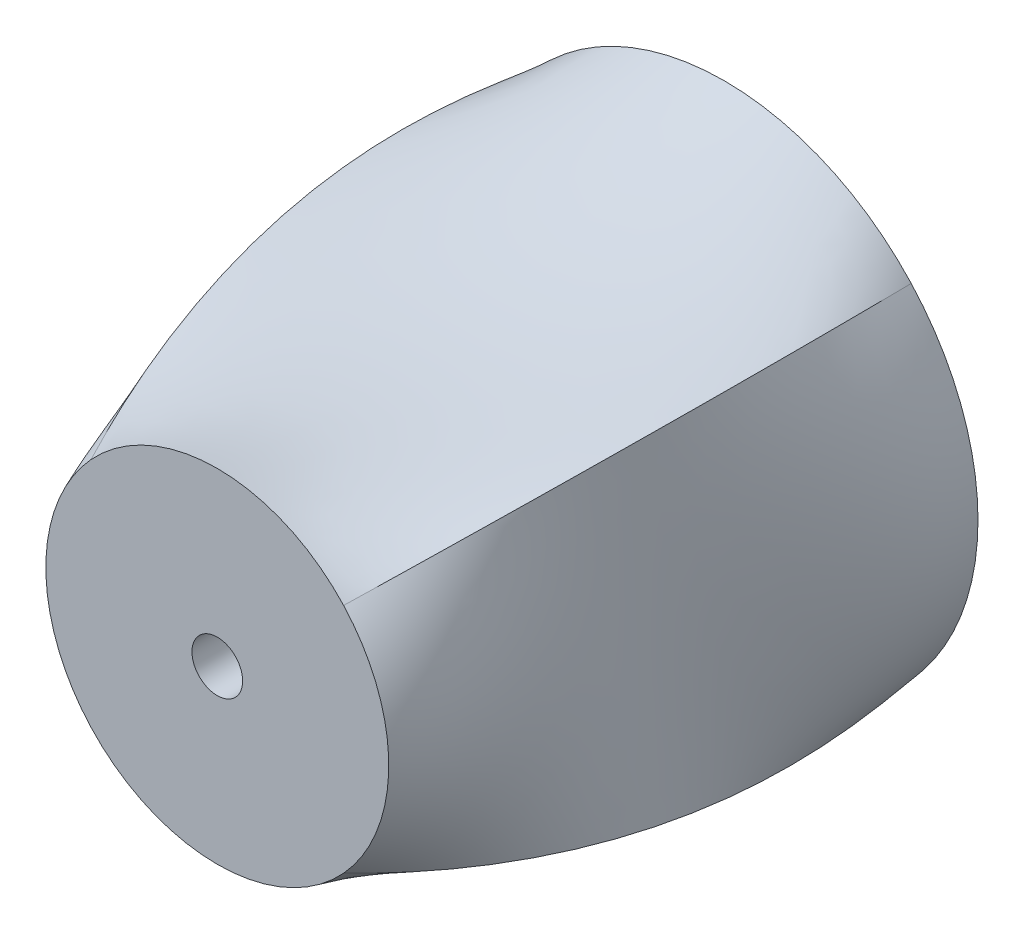
ISO-10303-21;
HEADER;
FILE_DESCRIPTION(('STEP AP214'),'2;1');
FILE_NAME('part.step','',(''),(''),'','','');
FILE_SCHEMA(('AUTOMOTIVE_DESIGN { 1 0 10303 214 1 1 1 1 }'));
ENDSEC;
DATA;
#1=APPLICATION_CONTEXT('core data for automotive mechanical design processes');
#2=APPLICATION_PROTOCOL_DEFINITION('international standard','automotive_design',2000,#1);
#3=PRODUCT_CONTEXT('',#1,'mechanical');
#4=PRODUCT('Part','Part','',(#3));
#5=PRODUCT_RELATED_PRODUCT_CATEGORY('part','',(#4));
#6=PRODUCT_DEFINITION_FORMATION('','',#4);
#7=PRODUCT_DEFINITION_CONTEXT('part definition',#1,'design');
#8=PRODUCT_DEFINITION('design','',#6,#7);
#9=PRODUCT_DEFINITION_SHAPE('','',#8);
#10=(LENGTH_UNIT() NAMED_UNIT(*) SI_UNIT(.MILLI.,.METRE.));
#11=(NAMED_UNIT(*) PLANE_ANGLE_UNIT() SI_UNIT($,.RADIAN.));
#12=(NAMED_UNIT(*) SI_UNIT($,.STERADIAN.) SOLID_ANGLE_UNIT());
#13=UNCERTAINTY_MEASURE_WITH_UNIT(LENGTH_MEASURE(1.E-05),#10,'distance_accuracy_value','');
#14=(GEOMETRIC_REPRESENTATION_CONTEXT(3) GLOBAL_UNCERTAINTY_ASSIGNED_CONTEXT((#13)) GLOBAL_UNIT_ASSIGNED_CONTEXT((#10,
#11,#12)) REPRESENTATION_CONTEXT('',''));
#15=CARTESIAN_POINT('',(0.,0.,0.));
#16=DIRECTION('',(0.,0.,1.));
#17=DIRECTION('',(1.,0.,0.));
#18=AXIS2_PLACEMENT_3D('',#15,#16,#17);
#19=CARTESIAN_POINT('',(0.,0.,100.));
#20=DIRECTION('',(0.,0.,1.));
#21=DIRECTION('',(1.,0.,0.));
#22=AXIS2_PLACEMENT_3D('',#19,#20,#21);
#23=PLANE('',#22);
#24=CARTESIAN_POINT('',(0.,0.,100.));
#25=DIRECTION('',(0.,0.,1.));
#26=DIRECTION('',(1.,0.,0.));
#27=AXIS2_PLACEMENT_3D('',#24,#25,#26);
#28=CIRCLE('',#27,5.);
#29=CARTESIAN_POINT('',(5.,0.,100.));
#30=VERTEX_POINT('',#29);
#31=EDGE_CURVE('E378',#30,#30,#28,.T.);
#32=ORIENTED_EDGE('',*,*,#31,.F.);
#33=EDGE_LOOP('',(#32));
#34=FACE_BOUND('',#33,.T.);
#35=CARTESIAN_POINT('',(0.,0.,100.));
#36=DIRECTION('',(0.,0.,1.));
#37=DIRECTION('',(1.,0.,0.));
#38=AXIS2_PLACEMENT_3D('',#35,#36,#37);
#39=CIRCLE('',#38,33.8111191585209);
#40=CARTESIAN_POINT('',(24.9085688378419,-22.863835575034,100.));
#41=VERTEX_POINT('',#40);
#42=CARTESIAN_POINT('',(24.9085688378419,22.863835575034,100.));
#43=VERTEX_POINT('',#42);
#44=EDGE_CURVE('E12',#41,#43,#39,.T.);
#45=ORIENTED_EDGE('',*,*,#44,.T.);
#46=CARTESIAN_POINT('',(-24.9085688378419,22.863835575034,100.));
#47=VERTEX_POINT('',#46);
#48=EDGE_CURVE('E159',#43,#47,#39,.T.);
#49=ORIENTED_EDGE('',*,*,#48,.T.);
#50=CARTESIAN_POINT('',(-24.9085688378419,-22.863835575034,100.));
#51=VERTEX_POINT('',#50);
#52=EDGE_CURVE('E304',#47,#51,#39,.T.);
#53=ORIENTED_EDGE('',*,*,#52,.T.);
#54=EDGE_CURVE('E224',#51,#41,#39,.T.);
#55=ORIENTED_EDGE('',*,*,#54,.T.);
#56=EDGE_LOOP('',(#45,#49,#53,#55));
#57=FACE_BOUND('',#56,.T.);
#58=ADVANCED_FACE('F149',(#34,#57),#23,.T.);
#59=CARTESIAN_POINT('',(0.,0.,0.));
#60=DIRECTION('',(0.,0.,1.));
#61=DIRECTION('',(1.,0.,0.));
#62=AXIS2_PLACEMENT_3D('',#59,#60,#61);
#63=PLANE('',#62);
#64=CARTESIAN_POINT('',(0.,0.,0.));
#65=DIRECTION('',(0.,0.,1.));
#66=DIRECTION('',(1.,0.,0.));
#67=AXIS2_PLACEMENT_3D('',#64,#65,#66);
#68=CIRCLE('',#67,5.);
#69=CARTESIAN_POINT('',(5.,0.,0.));
#70=VERTEX_POINT('',#69);
#71=EDGE_CURVE('E153',#70,#70,#68,.T.);
#72=ORIENTED_EDGE('',*,*,#71,.T.);
#73=EDGE_LOOP('',(#72));
#74=FACE_BOUND('',#73,.T.);
#75=CARTESIAN_POINT('',(0.,0.,0.));
#76=DIRECTION('',(0.,0.,1.));
#77=DIRECTION('',(1.,0.,0.));
#78=AXIS2_PLACEMENT_3D('',#75,#76,#77);
#79=CIRCLE('',#78,50.);
#80=CARTESIAN_POINT('',(-36.8348777824537,-33.8111191585209,0.));
#81=VERTEX_POINT('',#80);
#82=CARTESIAN_POINT('',(36.8348777824537,-33.8111191585209,0.));
#83=VERTEX_POINT('',#82);
#84=EDGE_CURVE('E192',#81,#83,#79,.T.);
#85=ORIENTED_EDGE('',*,*,#84,.F.);
#86=CARTESIAN_POINT('',(-36.8348777824537,33.8111191585209,0.));
#87=VERTEX_POINT('',#86);
#88=EDGE_CURVE('E197',#87,#81,#79,.T.);
#89=ORIENTED_EDGE('',*,*,#88,.F.);
#90=CARTESIAN_POINT('',(36.8348777824537,33.8111191585209,0.));
#91=VERTEX_POINT('',#90);
#92=EDGE_CURVE('E218',#91,#87,#79,.T.);
#93=ORIENTED_EDGE('',*,*,#92,.F.);
#94=EDGE_CURVE('E199',#83,#91,#79,.T.);
#95=ORIENTED_EDGE('',*,*,#94,.F.);
#96=EDGE_LOOP('',(#85,#89,#93,#95));
#97=FACE_BOUND('',#96,.T.);
#98=ADVANCED_FACE('F195',(#74,#97),#63,.F.);
#99=CARTESIAN_POINT('',(36.8348777824537,33.8111191585209,0.));
#100=CARTESIAN_POINT('',(38.7718322634079,35.5890699134266,17.092311153296));
#101=CARTESIAN_POINT('',(38.8550763426713,35.6654805234968,49.7278342205279));
#102=CARTESIAN_POINT('',(30.8209596336667,28.2908808577686,83.7589778199627));
#103=CARTESIAN_POINT('',(24.9085688378419,22.863835575034,100.));
#104=CARTESIAN_POINT('',(35.6512521446015,35.1005974956933,0.));
#105=CARTESIAN_POINT('',(37.3200602112271,36.1182014821361,17.0333694923934));
#106=CARTESIAN_POINT('',(37.1120592679594,35.2770256377292,49.7867765062497));
#107=CARTESIAN_POINT('',(29.6207735378854,28.5373493174208,83.7000361590601));
#108=CARTESIAN_POINT('',(24.1081746882319,23.7358096892433,100.));
#109=CARTESIAN_POINT('',(33.1620391276802,37.5407026365282,0.));
#110=CARTESIAN_POINT('',(34.2945543656487,37.0376130860452,16.9154861705881));
#111=CARTESIAN_POINT('',(33.7278074501986,34.6165886144866,49.9046610776935));
#112=CARTESIAN_POINT('',(27.1389872817655,28.9364017916043,83.5821528372548));
#113=CARTESIAN_POINT('',(22.4259723244545,25.3858734725413,100.));
#114=CARTESIAN_POINT('',(29.1024569762608,40.7676532680052,0.));
#115=CARTESIAN_POINT('',(29.6838530371143,38.321323826022,16.7514735213785));
#116=CARTESIAN_POINT('',(28.6947373206306,33.6808124087832,50.0686754655418));
#117=CARTESIAN_POINT('',(23.4024057279429,29.5210046177212,83.4181401880452));
#118=CARTESIAN_POINT('',(19.6810138029427,27.5679815727595,100.));
#119=CARTESIAN_POINT('',(24.7519278716949,43.5444546827326,0.));
#120=CARTESIAN_POINT('',(24.939349349651,39.4130258197402,16.6035868948552));
#121=CARTESIAN_POINT('',(23.7635363704026,32.8870543370538,50.2165636597578));
#122=CARTESIAN_POINT('',(19.5961857736985,30.0140454348376,83.2702535615218));
#123=CARTESIAN_POINT('',(16.7369875234113,29.4457678588824,100.));
#124=CARTESIAN_POINT('',(20.1547102412828,45.8546738217377,0.));
#125=CARTESIAN_POINT('',(20.097995282813,40.3283127881402,16.4764231935332));
#126=CARTESIAN_POINT('',(18.9034113312374,32.2200660392859,50.3437287090961));
#127=CARTESIAN_POINT('',(15.7449043428854,30.4304237221572,83.1430898601999));
#128=CARTESIAN_POINT('',(13.6251259783714,31.0078980915435,100.));
#129=CARTESIAN_POINT('',(15.3375461328778,47.6809844958922,0.));
#130=CARTESIAN_POINT('',(15.1630191733106,41.0524480145789,16.373487723796));
#131=CARTESIAN_POINT('',(14.1091519014495,31.6920505351794,50.446665270015));
#132=CARTESIAN_POINT('',(11.8557719273252,30.7604938573178,83.0401543904627));
#133=CARTESIAN_POINT('',(10.3766616603341,32.2430380313761,100.));
#134=CARTESIAN_POINT('',(8.70104771788511,49.4494620978008,0.));
#135=CARTESIAN_POINT('',(8.49790953013841,41.7553116740471,16.2725232461123));
#136=CARTESIAN_POINT('',(7.78490211984643,31.1792184068141,50.5476308179867));
#137=CARTESIAN_POINT('',(6.61937043305945,31.0815254562208,82.9391899127789));
#138=CARTESIAN_POINT('',(5.88324662983181,33.438791908226,99.9999999999999));
#139=CARTESIAN_POINT('',(-0.000209236240542032,50.3678759846702,0.));
#140=CARTESIAN_POINT('',(-0.00010542228565776,42.1210060939853,16.219977441377));
#141=CARTESIAN_POINT('',(3.59983072909771E-05,30.9123484217455,50.600177179741));
#142=CARTESIAN_POINT('',(3.40687133087295E-05,31.2486510487011,82.8866441080436));
#143=CARTESIAN_POINT('',(0.,34.0593373253841,99.9999999999999));
#144=CARTESIAN_POINT('',(-8.70063962683605,49.4495033626024,0.));
#145=CARTESIAN_POINT('',(-8.49770400696659,41.7553325945988,16.272522436667));
#146=CARTESIAN_POINT('',(-7.78497223949978,31.1792111777028,50.5476316274405));
#147=CARTESIAN_POINT('',(-6.61943697110283,31.0815188670714,82.9391891033337));
#148=CARTESIAN_POINT('',(-5.88324662983182,33.438791908226,100.));
#149=CARTESIAN_POINT('',(-15.3376172477267,47.6809918310989,0.));
#150=CARTESIAN_POINT('',(-15.1630550232553,41.0524517669311,16.3734872466629));
#151=CARTESIAN_POINT('',(-14.1091396476042,31.6920492167732,50.4466657471532));
#152=CARTESIAN_POINT('',(-11.8557603665109,30.7604927192323,83.0401539133295));
#153=CARTESIAN_POINT('',(-10.3766616603341,32.2430380313761,99.9999999999999));
#154=CARTESIAN_POINT('',(-20.154683472072,45.8546665558693,0.));
#155=CARTESIAN_POINT('',(-20.0979817873106,40.3283090868834,16.4764235597263));
#156=CARTESIAN_POINT('',(-18.9034159431783,32.2200673291799,50.3437283428992));
#157=CARTESIAN_POINT('',(-15.7449086967903,30.4304248659622,83.1430902263929));
#158=CARTESIAN_POINT('',(-13.6251259783714,31.0078980915435,99.9999999999999));
#159=CARTESIAN_POINT('',(-24.7519408621299,43.5444590036134,0.));
#160=CARTESIAN_POINT('',(-24.9393559017851,39.4130280194462,16.6035866957285));
#161=CARTESIAN_POINT('',(-23.7635341345276,32.8870535731406,50.2165638588865));
#162=CARTESIAN_POINT('',(-19.596183653335,30.0140447496585,83.2702533623952));
#163=CARTESIAN_POINT('',(-16.7369875234113,29.4457678588824,99.9999999999999));
#164=CARTESIAN_POINT('',(-29.1024500885329,40.7676508676481,0.));
#165=CARTESIAN_POINT('',(-29.6838495143119,38.3213225889856,16.7514736153119));
#166=CARTESIAN_POINT('',(-28.6947385354312,33.6808128414048,50.0686753716075));
#167=CARTESIAN_POINT('',(-23.4024068425225,29.5210049969655,83.4181402819785));
#168=CARTESIAN_POINT('',(-19.6810138029427,27.5679815727595,100.));
#169=CARTESIAN_POINT('',(-33.1620429354007,37.5407039772223,0.));
#170=CARTESIAN_POINT('',(-34.2945565245344,37.0376138494879,16.9154861345264));
#171=CARTESIAN_POINT('',(-33.7278066393317,34.6165883256796,49.9046611137556));
#172=CARTESIAN_POINT('',(-27.138986732125,28.9364016013782,83.582152801193));
#173=CARTESIAN_POINT('',(-22.4259723244545,25.3858734725413,100.));
#174=CARTESIAN_POINT('',(-35.6512521446015,35.1005974956933,0.));
#175=CARTESIAN_POINT('',(-37.3200596616155,36.118201289719,17.0333694803728));
#176=CARTESIAN_POINT('',(-37.1120596352194,35.2770257659405,49.7867765182705));
#177=CARTESIAN_POINT('',(-29.6207733546719,28.537349254012,83.7000361470395));
#178=CARTESIAN_POINT('',(-24.1081746882319,23.7358096892433,100.));
#179=CARTESIAN_POINT('',(-36.8348777824537,33.8111191585209,0.));
#180=CARTESIAN_POINT('',(-38.7718322634079,35.5890699134266,17.092311153296));
#181=CARTESIAN_POINT('',(-38.8550763426713,35.6654805234968,49.7278342205279));
#182=CARTESIAN_POINT('',(-30.8209596336667,28.2908808577686,83.7589778199627));
#183=CARTESIAN_POINT('',(-24.9085688378419,22.863835575034,100.));
#184=B_SPLINE_SURFACE_WITH_KNOTS('',3,3,((#99,#100,#101,#102,#103),(#104,#105,#106,#107,#108),
(#109,#110,#111,#112,#113),(#114,#115,#116,#117,#118),(#119,#120,#121,#122,#123),(#124,#125,
#126,#127,#128),(#129,#130,#131,#132,#133),(#134,#135,#136,#137,#138),(#139,#140,#141,#142,
#143),(#144,#145,#146,#147,#148),(#149,#150,#151,#152,#153),(#154,#155,#156,#157,#158),(#159,
#160,#161,#162,#163),(#164,#165,#166,#167,#168),(#169,#170,#171,#172,#173),(#174,#175,#176,#177,
#178),(#179,#180,#181,#182,#183)),.UNSPECIFIED.,.F.,.F.,.F.,(4,1,1,1,1,1,1,1,1,1,1,1,1,1,4),(4,
1,4),(0.,0.0625,0.125,0.1875,0.25,0.3125,0.375,0.5,0.625,0.6875,0.75,0.8125,0.875,0.9375,1.),
(0.,0.498848881956839,1.),.UNSPECIFIED.);
#185=CARTESIAN_POINT('',(-36.8348777824537,33.8111191585209,0.));
#186=CARTESIAN_POINT('',(-38.7718322634079,35.5890699134266,17.092311153296));
#187=CARTESIAN_POINT('',(-38.8550763426713,35.6654805234968,49.7278342205279));
#188=CARTESIAN_POINT('',(-30.8209596336667,28.2908808577686,83.7589778199627));
#189=CARTESIAN_POINT('',(-24.9085688378419,22.863835575034,100.));
#190=B_SPLINE_CURVE_WITH_KNOTS('',3,(#185,#186,#187,#188,#189),.UNSPECIFIED.,.F.,.F.,(4,1,4),
(0.,0.498848881956839,1.),.UNSPECIFIED.);
#191=EDGE_CURVE('E216',#87,#47,#190,.T.);
#192=CARTESIAN_POINT('',(36.8348777824537,33.8111191585209,0.));
#193=CARTESIAN_POINT('',(38.7718322634079,35.5890699134266,17.092311153296));
#194=CARTESIAN_POINT('',(38.8550763426713,35.6654805234968,49.7278342205279));
#195=CARTESIAN_POINT('',(30.8209596336667,28.2908808577686,83.7589778199627));
#196=CARTESIAN_POINT('',(24.9085688378419,22.863835575034,100.));
#197=B_SPLINE_CURVE_WITH_KNOTS('',3,(#192,#193,#194,#195,#196),.UNSPECIFIED.,.F.,.F.,(4,1,4),
(0.,0.498848881956839,1.),.UNSPECIFIED.);
#198=EDGE_CURVE('E205',#43,#91,#197,.F.);
#199=ORIENTED_EDGE('',*,*,#92,.T.);
#200=ORIENTED_EDGE('',*,*,#191,.T.);
#201=ORIENTED_EDGE('',*,*,#48,.F.);
#202=ORIENTED_EDGE('',*,*,#198,.T.);
#203=EDGE_LOOP('',(#199,#200,#201,#202));
#204=FACE_BOUND('',#203,.T.);
#205=ADVANCED_FACE('F317',(#204),#184,.T.);
#206=CARTESIAN_POINT('',(-36.8348777824537,33.8111191585209,0.));
#207=CARTESIAN_POINT('',(-38.7718322634079,35.5890699134266,17.092311153296));
#208=CARTESIAN_POINT('',(-38.8550763426713,35.6654805234968,49.7278342205279));
#209=CARTESIAN_POINT('',(-30.8209596336667,28.2908808577687,83.7589778199627));
#210=CARTESIAN_POINT('',(-24.9085688378419,22.863835575034,100.));
#211=CARTESIAN_POINT('',(-54.3789965340566,14.6980141770999,0.));
#212=CARTESIAN_POINT('',(-56.3159510150107,15.2906644287351,17.092311153296));
#213=CARTESIAN_POINT('',(-24.1379205245236,9.01316364780093,49.7278342205279));
#214=CARTESIAN_POINT('',(-42.6846854265004,11.748141268956,83.7589778199627));
#215=CARTESIAN_POINT('',(-36.7722946306756,9.93912617471108,100.));
#216=CARTESIAN_POINT('',(-54.3789965340566,-14.6980141770999,0.));
#217=CARTESIAN_POINT('',(-56.3159510150107,-15.2906644287351,17.092311153296));
#218=CARTESIAN_POINT('',(-24.1379205245236,-9.01316364780094,49.7278342205279));
#219=CARTESIAN_POINT('',(-42.6846854265004,-11.748141268956,83.7589778199627));
#220=CARTESIAN_POINT('',(-36.7722946306756,-9.93912617471106,100.));
#221=CARTESIAN_POINT('',(-36.8348777824537,-33.8111191585209,0.));
#222=CARTESIAN_POINT('',(-38.7718322634079,-35.5890699134266,17.092311153296));
#223=CARTESIAN_POINT('',(-38.8550763426713,-35.6654805234968,49.7278342205279));
#224=CARTESIAN_POINT('',(-30.8209596336667,-28.2908808577686,83.7589778199627));
#225=CARTESIAN_POINT('',(-24.9085688378419,-22.863835575034,100.));
#226=B_SPLINE_SURFACE_WITH_KNOTS('',3,3,((#206,#207,#208,#209,#210),(#211,#212,#213,#214,#215),
(#216,#217,#218,#219,#220),(#221,#222,#223,#224,#225)),.UNSPECIFIED.,.F.,.F.,.F.,(4,4),(4,1,4),
(0.,1.),(0.,0.498848881956839,1.),.UNSPECIFIED.);
#227=CARTESIAN_POINT('',(-36.8348777824537,-33.8111191585209,0.));
#228=CARTESIAN_POINT('',(-38.7718322634079,-35.5890699134266,17.092311153296));
#229=CARTESIAN_POINT('',(-38.8550763426713,-35.6654805234968,49.7278342205279));
#230=CARTESIAN_POINT('',(-30.8209596336667,-28.2908808577686,83.7589778199627));
#231=CARTESIAN_POINT('',(-24.9085688378419,-22.863835575034,100.));
#232=B_SPLINE_CURVE_WITH_KNOTS('',3,(#227,#228,#229,#230,#231),.UNSPECIFIED.,.F.,.F.,(4,1,4),
(0.,0.498848881956839,1.),.UNSPECIFIED.);
#233=EDGE_CURVE('E214',#81,#51,#232,.T.);
#234=ORIENTED_EDGE('',*,*,#88,.T.);
#235=ORIENTED_EDGE('',*,*,#233,.T.);
#236=ORIENTED_EDGE('',*,*,#52,.F.);
#237=ORIENTED_EDGE('',*,*,#191,.F.);
#238=EDGE_LOOP('',(#234,#235,#236,#237));
#239=FACE_BOUND('',#238,.T.);
#240=ADVANCED_FACE('F213',(#239),#226,.T.);
#241=CARTESIAN_POINT('',(36.8348777824537,-33.8111191585209,0.));
#242=CARTESIAN_POINT('',(38.7718322634079,-35.5890699134266,17.092311153296));
#243=CARTESIAN_POINT('',(38.8550763426713,-35.6654805234968,49.7278342205279));
#244=CARTESIAN_POINT('',(30.8209596336667,-28.2908808577687,83.7589778199627));
#245=CARTESIAN_POINT('',(24.9085688378419,-22.863835575034,100.));
#246=CARTESIAN_POINT('',(54.3789965340566,-14.6980141770999,0.));
#247=CARTESIAN_POINT('',(56.3159510150107,-15.2906644287351,17.092311153296));
#248=CARTESIAN_POINT('',(24.1379205245236,-9.01316364780093,49.7278342205279));
#249=CARTESIAN_POINT('',(42.6846854265004,-11.748141268956,83.7589778199627));
#250=CARTESIAN_POINT('',(36.7722946306756,-9.93912617471108,100.));
#251=CARTESIAN_POINT('',(54.3789965340566,14.6980141770999,0.));
#252=CARTESIAN_POINT('',(56.3159510150107,15.2906644287351,17.092311153296));
#253=CARTESIAN_POINT('',(24.1379205245236,9.01316364780094,49.7278342205279));
#254=CARTESIAN_POINT('',(42.6846854265004,11.7481412689559,83.7589778199627));
#255=CARTESIAN_POINT('',(36.7722946306756,9.93912617471106,100.));
#256=CARTESIAN_POINT('',(36.8348777824537,33.8111191585209,0.));
#257=CARTESIAN_POINT('',(38.7718322634079,35.5890699134266,17.092311153296));
#258=CARTESIAN_POINT('',(38.8550763426713,35.6654805234968,49.7278342205279));
#259=CARTESIAN_POINT('',(30.8209596336667,28.2908808577686,83.7589778199627));
#260=CARTESIAN_POINT('',(24.9085688378419,22.863835575034,100.));
#261=B_SPLINE_SURFACE_WITH_KNOTS('',3,3,((#241,#242,#243,#244,#245),(#246,#247,#248,#249,#250),
(#251,#252,#253,#254,#255),(#256,#257,#258,#259,#260)),.UNSPECIFIED.,.F.,.F.,.F.,(4,4),(4,1,4),
(0.,1.),(0.,0.498848881956839,1.),.UNSPECIFIED.);
#262=CARTESIAN_POINT('',(36.8348777824537,-33.8111191585209,0.));
#263=CARTESIAN_POINT('',(38.7718322634079,-35.5890699134266,17.092311153296));
#264=CARTESIAN_POINT('',(38.8550763426714,-35.6654805234968,49.7278342205279));
#265=CARTESIAN_POINT('',(30.8209596336667,-28.2908808577686,83.7589778199627));
#266=CARTESIAN_POINT('',(24.9085688378419,-22.863835575034,100.));
#267=B_SPLINE_CURVE_WITH_KNOTS('',3,(#262,#263,#264,#265,#266),.UNSPECIFIED.,.F.,.F.,(4,1,4),
(0.,0.498848881956839,1.),.UNSPECIFIED.);
#268=EDGE_CURVE('E227',#83,#41,#267,.T.);
#269=ORIENTED_EDGE('',*,*,#94,.T.);
#270=ORIENTED_EDGE('',*,*,#198,.F.);
#271=ORIENTED_EDGE('',*,*,#44,.F.);
#272=ORIENTED_EDGE('',*,*,#268,.F.);
#273=EDGE_LOOP('',(#269,#270,#271,#272));
#274=FACE_BOUND('',#273,.T.);
#275=ADVANCED_FACE('F266',(#274),#261,.T.);
#276=CARTESIAN_POINT('',(-36.8348777824537,-33.8111191585209,0.));
#277=CARTESIAN_POINT('',(-38.7718322634079,-35.5890699134266,17.092311153296));
#278=CARTESIAN_POINT('',(-38.8550763426713,-35.6654805234968,49.7278342205279));
#279=CARTESIAN_POINT('',(-30.8209596336667,-28.2908808577686,83.7589778199627));
#280=CARTESIAN_POINT('',(-24.9085688378419,-22.863835575034,100.));
#281=CARTESIAN_POINT('',(-35.6512521446015,-35.1005974956933,0.));
#282=CARTESIAN_POINT('',(-37.3200602112271,-36.118201482136,17.0333694923934));
#283=CARTESIAN_POINT('',(-37.1120592679594,-35.2770256377292,49.7867765062497));
#284=CARTESIAN_POINT('',(-29.6207735378854,-28.5373493174208,83.7000361590602));
#285=CARTESIAN_POINT('',(-24.1081746882319,-23.7358096892433,100.));
#286=CARTESIAN_POINT('',(-33.1620391276802,-37.5407026365282,0.));
#287=CARTESIAN_POINT('',(-34.2945543656487,-37.0376130860451,16.9154861705881));
#288=CARTESIAN_POINT('',(-33.7278074501986,-34.6165886144866,49.9046610776934));
#289=CARTESIAN_POINT('',(-27.1389872817655,-28.9364017916043,83.5821528372549));
#290=CARTESIAN_POINT('',(-22.4259723244545,-25.3858734725413,100.));
#291=CARTESIAN_POINT('',(-29.1024569762607,-40.7676532680052,0.));
#292=CARTESIAN_POINT('',(-29.6838530371143,-38.321323826022,16.7514735213785));
#293=CARTESIAN_POINT('',(-28.6947373206306,-33.6808124087831,50.0686754655418));
#294=CARTESIAN_POINT('',(-23.4024057279429,-29.5210046177212,83.4181401880453));
#295=CARTESIAN_POINT('',(-19.6810138029427,-27.5679815727595,100.));
#296=CARTESIAN_POINT('',(-24.751927871695,-43.5444546827326,0.));
#297=CARTESIAN_POINT('',(-24.9393493496511,-39.4130258197401,16.6035868948552));
#298=CARTESIAN_POINT('',(-23.7635363704026,-32.8870543370539,50.2165636597578));
#299=CARTESIAN_POINT('',(-19.5961857736985,-30.0140454348376,83.2702535615219));
#300=CARTESIAN_POINT('',(-16.7369875234113,-29.4457678588824,100.));
#301=CARTESIAN_POINT('',(-20.1547102412828,-45.8546738217377,0.));
#302=CARTESIAN_POINT('',(-20.097995282813,-40.3283127881402,16.4764231935332));
#303=CARTESIAN_POINT('',(-18.9034113312374,-32.2200660392859,50.3437287090962));
#304=CARTESIAN_POINT('',(-15.7449043428854,-30.4304237221572,83.1430898601999));
#305=CARTESIAN_POINT('',(-13.6251259783714,-31.0078980915435,99.9999999999999));
#306=CARTESIAN_POINT('',(-15.3375461328779,-47.6809844958922,0.));
#307=CARTESIAN_POINT('',(-15.1630191733106,-41.0524480145789,16.373487723796));
#308=CARTESIAN_POINT('',(-14.1091519014495,-31.6920505351794,50.4466652700151));
#309=CARTESIAN_POINT('',(-11.8557719273252,-30.7604938573178,83.0401543904627));
#310=CARTESIAN_POINT('',(-10.3766616603342,-32.2430380313761,100.));
#311=CARTESIAN_POINT('',(-8.70104771788512,-49.4494620978008,0.));
#312=CARTESIAN_POINT('',(-8.49790953013842,-41.7553116740471,16.2725232461123));
#313=CARTESIAN_POINT('',(-7.78490211984643,-31.1792184068141,50.5476308179867));
#314=CARTESIAN_POINT('',(-6.61937043305945,-31.0815254562208,82.939189912779));
#315=CARTESIAN_POINT('',(-5.88324662983181,-33.438791908226,100.));
#316=CARTESIAN_POINT('',(0.000209236240528154,-50.3678759846701,0.));
#317=CARTESIAN_POINT('',(0.000105422285660219,-42.1210060939853,16.219977441377));
#318=CARTESIAN_POINT('',(-3.59983072904582E-05,-30.9123484217455,50.6001771797409));
#319=CARTESIAN_POINT('',(-3.40687133122535E-05,-31.2486510487011,82.8866441080438));
#320=CARTESIAN_POINT('',(0.,-34.0593373253841,99.9999999999999));
#321=CARTESIAN_POINT('',(8.70063962683601,-49.4495033626024,0.));
#322=CARTESIAN_POINT('',(8.49770400696656,-41.7553325945988,16.272522436667));
#323=CARTESIAN_POINT('',(7.7849722394998,-31.1792111777028,50.5476316274405));
#324=CARTESIAN_POINT('',(6.61943697110282,-31.0815188670714,82.9391891033337));
#325=CARTESIAN_POINT('',(5.8832466298318,-33.4387919082261,100.));
#326=CARTESIAN_POINT('',(15.3376172477267,-47.6809918310989,0.));
#327=CARTESIAN_POINT('',(15.1630550232553,-41.0524517669311,16.3734872466629));
#328=CARTESIAN_POINT('',(14.1091396476042,-31.6920492167732,50.4466657471532));
#329=CARTESIAN_POINT('',(11.855760366511,-30.7604927192323,83.0401539133295));
#330=CARTESIAN_POINT('',(10.3766616603341,-32.2430380313761,99.9999999999999));
#331=CARTESIAN_POINT('',(20.154683472072,-45.8546665558693,0.));
#332=CARTESIAN_POINT('',(20.0979817873106,-40.3283090868834,16.4764235597263));
#333=CARTESIAN_POINT('',(18.9034159431784,-32.2200673291799,50.3437283428992));
#334=CARTESIAN_POINT('',(15.7449086967902,-30.4304248659622,83.1430902263929));
#335=CARTESIAN_POINT('',(13.6251259783714,-31.0078980915434,99.9999999999999));
#336=CARTESIAN_POINT('',(24.7519408621299,-43.5444590036134,0.));
#337=CARTESIAN_POINT('',(24.9393559017851,-39.4130280194462,16.6035866957285));
#338=CARTESIAN_POINT('',(23.7635341345276,-32.8870535731406,50.2165638588865));
#339=CARTESIAN_POINT('',(19.596183653335,-30.0140447496586,83.2702533623952));
#340=CARTESIAN_POINT('',(16.7369875234113,-29.4457678588824,99.9999999999999));
#341=CARTESIAN_POINT('',(29.1024500885329,-40.7676508676481,0.));
#342=CARTESIAN_POINT('',(29.6838495143119,-38.3213225889855,16.7514736153119));
#343=CARTESIAN_POINT('',(28.6947385354312,-33.6808128414049,50.0686753716075));
#344=CARTESIAN_POINT('',(23.4024068425225,-29.5210049969656,83.4181402819785));
#345=CARTESIAN_POINT('',(19.6810138029427,-27.5679815727595,100.));
#346=CARTESIAN_POINT('',(33.1620429354007,-37.5407039772223,0.));
#347=CARTESIAN_POINT('',(34.2945565245344,-37.037613849488,16.9154861345264));
#348=CARTESIAN_POINT('',(33.7278066393318,-34.6165883256796,49.9046611137556));
#349=CARTESIAN_POINT('',(27.138986732125,-28.9364016013782,83.582152801193));
#350=CARTESIAN_POINT('',(22.4259723244545,-25.3858734725413,100.));
#351=CARTESIAN_POINT('',(35.6512521446014,-35.1005974956933,0.));
#352=CARTESIAN_POINT('',(37.3200596616155,-36.118201289719,17.0333694803728));
#353=CARTESIAN_POINT('',(37.1120596352195,-35.2770257659405,49.7867765182705));
#354=CARTESIAN_POINT('',(29.6207733546719,-28.537349254012,83.7000361470395));
#355=CARTESIAN_POINT('',(24.1081746882319,-23.7358096892433,100.));
#356=CARTESIAN_POINT('',(36.8348777824537,-33.8111191585209,0.));
#357=CARTESIAN_POINT('',(38.7718322634079,-35.5890699134266,17.092311153296));
#358=CARTESIAN_POINT('',(38.8550763426714,-35.6654805234968,49.7278342205279));
#359=CARTESIAN_POINT('',(30.8209596336667,-28.2908808577686,83.7589778199627));
#360=CARTESIAN_POINT('',(24.9085688378419,-22.863835575034,100.));
#361=B_SPLINE_SURFACE_WITH_KNOTS('',3,3,((#276,#277,#278,#279,#280),(#281,#282,#283,#284,#285),
(#286,#287,#288,#289,#290),(#291,#292,#293,#294,#295),(#296,#297,#298,#299,#300),(#301,#302,
#303,#304,#305),(#306,#307,#308,#309,#310),(#311,#312,#313,#314,#315),(#316,#317,#318,#319,
#320),(#321,#322,#323,#324,#325),(#326,#327,#328,#329,#330),(#331,#332,#333,#334,#335),(#336,
#337,#338,#339,#340),(#341,#342,#343,#344,#345),(#346,#347,#348,#349,#350),(#351,#352,#353,#354,
#355),(#356,#357,#358,#359,#360)),.UNSPECIFIED.,.F.,.F.,.F.,(4,1,1,1,1,1,1,1,1,1,1,1,1,1,4),(4,
1,4),(0.,0.0625,0.125,0.1875,0.25,0.3125,0.375,0.5,0.625,0.6875,0.75,0.8125,0.875,0.9375,1.),
(0.,0.498848881956839,1.),.UNSPECIFIED.);
#362=ORIENTED_EDGE('',*,*,#84,.T.);
#363=ORIENTED_EDGE('',*,*,#268,.T.);
#364=ORIENTED_EDGE('',*,*,#54,.F.);
#365=ORIENTED_EDGE('',*,*,#233,.F.);
#366=EDGE_LOOP('',(#362,#363,#364,#365));
#367=FACE_BOUND('',#366,.T.);
#368=ADVANCED_FACE('F223',(#367),#361,.T.);
#369=CARTESIAN_POINT('',(0.,0.,-0.0870650552205338));
#370=DIRECTION('',(0.,0.,1.));
#371=DIRECTION('',(1.,0.,0.));
#372=AXIS2_PLACEMENT_3D('',#369,#370,#371);
#373=CYLINDRICAL_SURFACE('',#372,5.);
#374=ORIENTED_EDGE('',*,*,#31,.T.);
#375=EDGE_LOOP('',(#374));
#376=FACE_BOUND('',#375,.T.);
#377=ORIENTED_EDGE('',*,*,#71,.F.);
#378=EDGE_LOOP('',(#377));
#379=FACE_BOUND('',#378,.T.);
#380=ADVANCED_FACE('F265',(#376,#379),#373,.F.);
#381=CLOSED_SHELL('',(#58,#98,#205,#240,#275,#368,#380));
#382=MANIFOLD_SOLID_BREP('B2',#381);
#383=ADVANCED_BREP_SHAPE_REPRESENTATION('',(#18,#382),#14);
#384=SHAPE_DEFINITION_REPRESENTATION(#9,#383);
ENDSEC;
END-ISO-10303-21;
